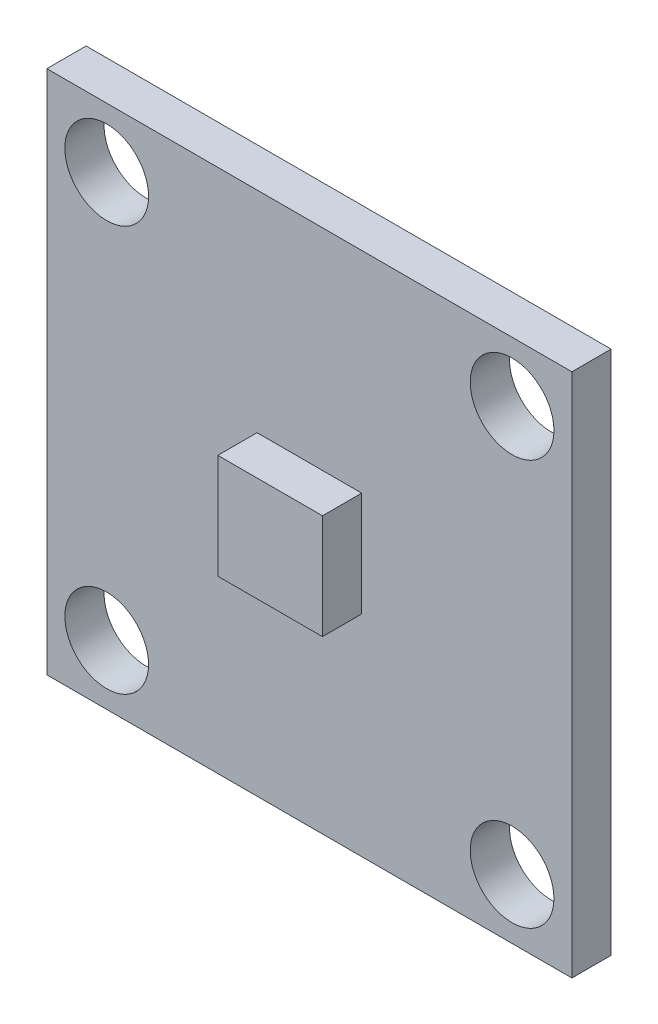
ISO-10303-21;
HEADER;
FILE_DESCRIPTION(('STEP AP214'),'2;1');
FILE_NAME('part.step','',(''),(''),'','','');
FILE_SCHEMA(('AUTOMOTIVE_DESIGN { 1 0 10303 214 1 1 1 1 }'));
ENDSEC;
DATA;
#1=APPLICATION_CONTEXT('core data for automotive mechanical design processes');
#2=APPLICATION_PROTOCOL_DEFINITION('international standard','automotive_design',2000,#1);
#3=PRODUCT_CONTEXT('',#1,'mechanical');
#4=PRODUCT('Part','Part','',(#3));
#5=PRODUCT_RELATED_PRODUCT_CATEGORY('part','',(#4));
#6=PRODUCT_DEFINITION_FORMATION('','',#4);
#7=PRODUCT_DEFINITION_CONTEXT('part definition',#1,'design');
#8=PRODUCT_DEFINITION('design','',#6,#7);
#9=PRODUCT_DEFINITION_SHAPE('','',#8);
#10=(LENGTH_UNIT() NAMED_UNIT(*) SI_UNIT(.MILLI.,.METRE.));
#11=(NAMED_UNIT(*) PLANE_ANGLE_UNIT() SI_UNIT($,.RADIAN.));
#12=(NAMED_UNIT(*) SI_UNIT($,.STERADIAN.) SOLID_ANGLE_UNIT());
#13=UNCERTAINTY_MEASURE_WITH_UNIT(LENGTH_MEASURE(1.E-05),#10,'distance_accuracy_value','');
#14=(GEOMETRIC_REPRESENTATION_CONTEXT(3) GLOBAL_UNCERTAINTY_ASSIGNED_CONTEXT((#13)) GLOBAL_UNIT_ASSIGNED_CONTEXT((#10,
#11,#12)) REPRESENTATION_CONTEXT('',''));
#15=CARTESIAN_POINT('',(0.,0.,0.));
#16=DIRECTION('',(0.,0.,1.));
#17=DIRECTION('',(1.,0.,0.));
#18=AXIS2_PLACEMENT_3D('',#15,#16,#17);
#19=CARTESIAN_POINT('',(0.,0.,1.5));
#20=DIRECTION('',(0.,0.,1.));
#21=DIRECTION('',(1.,0.,0.));
#22=AXIS2_PLACEMENT_3D('',#19,#20,#21);
#23=PLANE('',#22);
#24=CARTESIAN_POINT('',(-7.747,-7.747,1.5));
#25=DIRECTION('',(0.,0.,1.));
#26=DIRECTION('',(1.,0.,0.));
#27=AXIS2_PLACEMENT_3D('',#24,#25,#26);
#28=CIRCLE('',#27,1.6);
#29=CARTESIAN_POINT('',(-6.147,-7.747,1.5));
#30=VERTEX_POINT('',#29);
#31=EDGE_CURVE('E166',#30,#30,#28,.T.);
#32=ORIENTED_EDGE('',*,*,#31,.F.);
#33=EDGE_LOOP('',(#32));
#34=FACE_BOUND('',#33,.T.);
#35=CARTESIAN_POINT('',(-7.747,7.747,1.5));
#36=DIRECTION('',(0.,0.,1.));
#37=DIRECTION('',(1.,0.,0.));
#38=AXIS2_PLACEMENT_3D('',#35,#36,#37);
#39=CIRCLE('',#38,1.6);
#40=CARTESIAN_POINT('',(-6.147,7.747,1.5));
#41=VERTEX_POINT('',#40);
#42=EDGE_CURVE('E182',#41,#41,#39,.T.);
#43=ORIENTED_EDGE('',*,*,#42,.F.);
#44=EDGE_LOOP('',(#43));
#45=FACE_BOUND('',#44,.T.);
#46=DIRECTION('',(0.,-1.,0.));
#47=VECTOR('',#46,1.);
#48=CARTESIAN_POINT('',(-10.033,10.033,1.5));
#49=LINE('',#48,#47);
#50=CARTESIAN_POINT('',(-10.033,10.033,1.5));
#51=VERTEX_POINT('',#50);
#52=CARTESIAN_POINT('',(-10.033,-10.033,1.5));
#53=VERTEX_POINT('',#52);
#54=EDGE_CURVE('E190',#51,#53,#49,.T.);
#55=ORIENTED_EDGE('',*,*,#54,.T.);
#56=DIRECTION('',(1.,0.,0.));
#57=VECTOR('',#56,1.);
#58=CARTESIAN_POINT('',(-10.033,-10.033,1.5));
#59=LINE('',#58,#57);
#60=CARTESIAN_POINT('',(10.033,-10.033,1.5));
#61=VERTEX_POINT('',#60);
#62=EDGE_CURVE('E102',#53,#61,#59,.T.);
#63=ORIENTED_EDGE('',*,*,#62,.T.);
#64=DIRECTION('',(0.,1.,0.));
#65=VECTOR('',#64,1.);
#66=CARTESIAN_POINT('',(10.033,10.033,1.5));
#67=LINE('',#66,#65);
#68=CARTESIAN_POINT('',(10.033,10.033,1.5));
#69=VERTEX_POINT('',#68);
#70=EDGE_CURVE('E195',#61,#69,#67,.T.);
#71=ORIENTED_EDGE('',*,*,#70,.T.);
#72=DIRECTION('',(-1.,0.,0.));
#73=VECTOR('',#72,1.);
#74=CARTESIAN_POINT('',(-10.033,10.033,1.5));
#75=LINE('',#74,#73);
#76=EDGE_CURVE('E74',#69,#51,#75,.T.);
#77=ORIENTED_EDGE('',*,*,#76,.T.);
#78=EDGE_LOOP('',(#55,#63,#71,#77));
#79=FACE_BOUND('',#78,.T.);
#80=CARTESIAN_POINT('',(7.747,7.747,1.5));
#81=DIRECTION('',(0.,0.,1.));
#82=DIRECTION('',(1.,0.,0.));
#83=AXIS2_PLACEMENT_3D('',#80,#81,#82);
#84=CIRCLE('',#83,1.6);
#85=CARTESIAN_POINT('',(9.34700000000001,7.747,1.5));
#86=VERTEX_POINT('',#85);
#87=EDGE_CURVE('E174',#86,#86,#84,.T.);
#88=ORIENTED_EDGE('',*,*,#87,.F.);
#89=EDGE_LOOP('',(#88));
#90=FACE_BOUND('',#89,.T.);
#91=CARTESIAN_POINT('',(7.747,-7.747,1.5));
#92=DIRECTION('',(0.,0.,1.));
#93=DIRECTION('',(1.,0.,0.));
#94=AXIS2_PLACEMENT_3D('',#91,#92,#93);
#95=CIRCLE('',#94,1.6);
#96=CARTESIAN_POINT('',(9.34700000000001,-7.747,1.5));
#97=VERTEX_POINT('',#96);
#98=EDGE_CURVE('E157',#97,#97,#95,.T.);
#99=ORIENTED_EDGE('',*,*,#98,.F.);
#100=EDGE_LOOP('',(#99));
#101=FACE_BOUND('',#100,.T.);
#102=DIRECTION('',(1.,0.,0.));
#103=VECTOR('',#102,1.);
#104=CARTESIAN_POINT('',(-2.,-2.,1.5));
#105=LINE('',#104,#103);
#106=CARTESIAN_POINT('',(-2.,-2.,1.5));
#107=VERTEX_POINT('',#106);
#108=CARTESIAN_POINT('',(2.,-2.,1.5));
#109=VERTEX_POINT('',#108);
#110=EDGE_CURVE('E403',#107,#109,#105,.T.);
#111=ORIENTED_EDGE('',*,*,#110,.F.);
#112=DIRECTION('',(0.,-1.,0.));
#113=VECTOR('',#112,1.);
#114=CARTESIAN_POINT('',(-2.,2.,1.5));
#115=LINE('',#114,#113);
#116=CARTESIAN_POINT('',(-2.,2.,1.5));
#117=VERTEX_POINT('',#116);
#118=EDGE_CURVE('E149',#117,#107,#115,.T.);
#119=ORIENTED_EDGE('',*,*,#118,.F.);
#120=DIRECTION('',(-1.,0.,0.));
#121=VECTOR('',#120,1.);
#122=CARTESIAN_POINT('',(-2.,2.,1.5));
#123=LINE('',#122,#121);
#124=CARTESIAN_POINT('',(2.,2.,1.5));
#125=VERTEX_POINT('',#124);
#126=EDGE_CURVE('E145',#125,#117,#123,.T.);
#127=ORIENTED_EDGE('',*,*,#126,.F.);
#128=DIRECTION('',(0.,1.,0.));
#129=VECTOR('',#128,1.);
#130=CARTESIAN_POINT('',(2.,2.,1.5));
#131=LINE('',#130,#129);
#132=EDGE_CURVE('E399',#109,#125,#131,.T.);
#133=ORIENTED_EDGE('',*,*,#132,.F.);
#134=EDGE_LOOP('',(#111,#119,#127,#133));
#135=FACE_BOUND('',#134,.T.);
#136=ADVANCED_FACE('F49',(#34,#45,#79,#90,#101,#135),#23,.T.);
#137=CARTESIAN_POINT('',(0.,0.,0.));
#138=DIRECTION('',(0.,0.,1.));
#139=DIRECTION('',(1.,0.,0.));
#140=AXIS2_PLACEMENT_3D('',#137,#138,#139);
#141=PLANE('',#140);
#142=DIRECTION('',(0.,-1.,0.));
#143=VECTOR('',#142,1.);
#144=CARTESIAN_POINT('',(-10.033,10.033,0.));
#145=LINE('',#144,#143);
#146=CARTESIAN_POINT('',(-10.033,10.033,0.));
#147=VERTEX_POINT('',#146);
#148=CARTESIAN_POINT('',(-10.033,-10.033,0.));
#149=VERTEX_POINT('',#148);
#150=EDGE_CURVE('E186',#147,#149,#145,.T.);
#151=ORIENTED_EDGE('',*,*,#150,.F.);
#152=DIRECTION('',(-1.,0.,0.));
#153=VECTOR('',#152,1.);
#154=CARTESIAN_POINT('',(-10.033,10.033,0.));
#155=LINE('',#154,#153);
#156=CARTESIAN_POINT('',(10.033,10.033,0.));
#157=VERTEX_POINT('',#156);
#158=EDGE_CURVE('E95',#157,#147,#155,.T.);
#159=ORIENTED_EDGE('',*,*,#158,.F.);
#160=DIRECTION('',(0.,1.,0.));
#161=VECTOR('',#160,1.);
#162=CARTESIAN_POINT('',(10.033,10.033,0.));
#163=LINE('',#162,#161);
#164=CARTESIAN_POINT('',(10.033,-10.033,0.));
#165=VERTEX_POINT('',#164);
#166=EDGE_CURVE('E207',#165,#157,#163,.T.);
#167=ORIENTED_EDGE('',*,*,#166,.F.);
#168=DIRECTION('',(1.,0.,0.));
#169=VECTOR('',#168,1.);
#170=CARTESIAN_POINT('',(-10.033,-10.033,0.));
#171=LINE('',#170,#169);
#172=EDGE_CURVE('E204',#149,#165,#171,.T.);
#173=ORIENTED_EDGE('',*,*,#172,.F.);
#174=EDGE_LOOP('',(#151,#159,#167,#173));
#175=FACE_BOUND('',#174,.T.);
#176=CARTESIAN_POINT('',(-7.747,7.747,0.));
#177=DIRECTION('',(0.,0.,1.));
#178=DIRECTION('',(1.,0.,0.));
#179=AXIS2_PLACEMENT_3D('',#176,#177,#178);
#180=CIRCLE('',#179,1.6);
#181=CARTESIAN_POINT('',(-6.147,7.747,0.));
#182=VERTEX_POINT('',#181);
#183=EDGE_CURVE('E178',#182,#182,#180,.T.);
#184=ORIENTED_EDGE('',*,*,#183,.T.);
#185=EDGE_LOOP('',(#184));
#186=FACE_BOUND('',#185,.T.);
#187=CARTESIAN_POINT('',(7.747,7.747,0.));
#188=DIRECTION('',(0.,0.,1.));
#189=DIRECTION('',(1.,0.,0.));
#190=AXIS2_PLACEMENT_3D('',#187,#188,#189);
#191=CIRCLE('',#190,1.6);
#192=CARTESIAN_POINT('',(9.34700000000001,7.747,0.));
#193=VERTEX_POINT('',#192);
#194=EDGE_CURVE('E170',#193,#193,#191,.T.);
#195=ORIENTED_EDGE('',*,*,#194,.T.);
#196=EDGE_LOOP('',(#195));
#197=FACE_BOUND('',#196,.T.);
#198=CARTESIAN_POINT('',(-7.747,-7.747,0.));
#199=DIRECTION('',(0.,0.,1.));
#200=DIRECTION('',(1.,0.,0.));
#201=AXIS2_PLACEMENT_3D('',#198,#199,#200);
#202=CIRCLE('',#201,1.6);
#203=CARTESIAN_POINT('',(-6.147,-7.747,0.));
#204=VERTEX_POINT('',#203);
#205=EDGE_CURVE('E164',#204,#204,#202,.T.);
#206=ORIENTED_EDGE('',*,*,#205,.T.);
#207=EDGE_LOOP('',(#206));
#208=FACE_BOUND('',#207,.T.);
#209=CARTESIAN_POINT('',(7.747,-7.747,0.));
#210=DIRECTION('',(0.,0.,1.));
#211=DIRECTION('',(1.,0.,0.));
#212=AXIS2_PLACEMENT_3D('',#209,#210,#211);
#213=CIRCLE('',#212,1.6);
#214=CARTESIAN_POINT('',(9.34700000000001,-7.747,0.));
#215=VERTEX_POINT('',#214);
#216=EDGE_CURVE('E152',#215,#215,#213,.T.);
#217=ORIENTED_EDGE('',*,*,#216,.T.);
#218=EDGE_LOOP('',(#217));
#219=FACE_BOUND('',#218,.T.);
#220=ADVANCED_FACE('F225',(#175,#186,#197,#208,#219),#141,.F.);
#221=CARTESIAN_POINT('',(-10.033,10.033,1.5));
#222=DIRECTION('',(1.,0.,0.));
#223=DIRECTION('',(0.,0.,-1.));
#224=AXIS2_PLACEMENT_3D('',#221,#222,#223);
#225=PLANE('',#224);
#226=ORIENTED_EDGE('',*,*,#150,.T.);
#227=DIRECTION('',(0.,0.,-1.));
#228=VECTOR('',#227,1.);
#229=CARTESIAN_POINT('',(-10.033,-10.033,1.5));
#230=LINE('',#229,#228);
#231=EDGE_CURVE('E11',#53,#149,#230,.T.);
#232=ORIENTED_EDGE('',*,*,#231,.F.);
#233=ORIENTED_EDGE('',*,*,#54,.F.);
#234=DIRECTION('',(0.,0.,-1.));
#235=VECTOR('',#234,1.);
#236=CARTESIAN_POINT('',(-10.033,10.033,1.5));
#237=LINE('',#236,#235);
#238=EDGE_CURVE('E200',#51,#147,#237,.T.);
#239=ORIENTED_EDGE('',*,*,#238,.T.);
#240=EDGE_LOOP('',(#226,#232,#233,#239));
#241=FACE_BOUND('',#240,.T.);
#242=ADVANCED_FACE('F51',(#241),#225,.F.);
#243=CARTESIAN_POINT('',(-10.033,-10.033,1.5));
#244=DIRECTION('',(0.,1.,0.));
#245=DIRECTION('',(0.,0.,1.));
#246=AXIS2_PLACEMENT_3D('',#243,#244,#245);
#247=PLANE('',#246);
#248=ORIENTED_EDGE('',*,*,#172,.T.);
#249=DIRECTION('',(0.,0.,-1.));
#250=VECTOR('',#249,1.);
#251=CARTESIAN_POINT('',(10.033,-10.033,1.5));
#252=LINE('',#251,#250);
#253=EDGE_CURVE('E58',#61,#165,#252,.T.);
#254=ORIENTED_EDGE('',*,*,#253,.F.);
#255=ORIENTED_EDGE('',*,*,#62,.F.);
#256=ORIENTED_EDGE('',*,*,#231,.T.);
#257=EDGE_LOOP('',(#248,#254,#255,#256));
#258=FACE_BOUND('',#257,.T.);
#259=ADVANCED_FACE('F241',(#258),#247,.F.);
#260=CARTESIAN_POINT('',(10.033,10.033,1.5));
#261=DIRECTION('',(-1.,0.,0.));
#262=DIRECTION('',(0.,0.,1.));
#263=AXIS2_PLACEMENT_3D('',#260,#261,#262);
#264=PLANE('',#263);
#265=ORIENTED_EDGE('',*,*,#166,.T.);
#266=DIRECTION('',(0.,0.,-1.));
#267=VECTOR('',#266,1.);
#268=CARTESIAN_POINT('',(10.033,10.033,1.5));
#269=LINE('',#268,#267);
#270=EDGE_CURVE('E214',#69,#157,#269,.T.);
#271=ORIENTED_EDGE('',*,*,#270,.F.);
#272=ORIENTED_EDGE('',*,*,#70,.F.);
#273=ORIENTED_EDGE('',*,*,#253,.T.);
#274=EDGE_LOOP('',(#265,#271,#272,#273));
#275=FACE_BOUND('',#274,.T.);
#276=ADVANCED_FACE('F221',(#275),#264,.F.);
#277=CARTESIAN_POINT('',(-10.033,10.033,1.5));
#278=DIRECTION('',(0.,-1.,0.));
#279=DIRECTION('',(0.,0.,-1.));
#280=AXIS2_PLACEMENT_3D('',#277,#278,#279);
#281=PLANE('',#280);
#282=ORIENTED_EDGE('',*,*,#158,.T.);
#283=ORIENTED_EDGE('',*,*,#238,.F.);
#284=ORIENTED_EDGE('',*,*,#76,.F.);
#285=ORIENTED_EDGE('',*,*,#270,.T.);
#286=EDGE_LOOP('',(#282,#283,#284,#285));
#287=FACE_BOUND('',#286,.T.);
#288=ADVANCED_FACE('F230',(#287),#281,.F.);
#289=CARTESIAN_POINT('',(-7.747,7.747,1.5));
#290=DIRECTION('',(0.,0.,-1.));
#291=DIRECTION('',(-1.,0.,0.));
#292=AXIS2_PLACEMENT_3D('',#289,#290,#291);
#293=CYLINDRICAL_SURFACE('',#292,1.6);
#294=ORIENTED_EDGE('',*,*,#42,.T.);
#295=EDGE_LOOP('',(#294));
#296=FACE_BOUND('',#295,.T.);
#297=ORIENTED_EDGE('',*,*,#183,.F.);
#298=EDGE_LOOP('',(#297));
#299=FACE_BOUND('',#298,.T.);
#300=ADVANCED_FACE('F232',(#296,#299),#293,.F.);
#301=CARTESIAN_POINT('',(7.747,7.747,1.5));
#302=DIRECTION('',(0.,0.,-1.));
#303=DIRECTION('',(-1.,0.,0.));
#304=AXIS2_PLACEMENT_3D('',#301,#302,#303);
#305=CYLINDRICAL_SURFACE('',#304,1.6);
#306=ORIENTED_EDGE('',*,*,#87,.T.);
#307=EDGE_LOOP('',(#306));
#308=FACE_BOUND('',#307,.T.);
#309=ORIENTED_EDGE('',*,*,#194,.F.);
#310=EDGE_LOOP('',(#309));
#311=FACE_BOUND('',#310,.T.);
#312=ADVANCED_FACE('F238',(#308,#311),#305,.F.);
#313=CARTESIAN_POINT('',(-7.747,-7.747,1.5));
#314=DIRECTION('',(0.,0.,-1.));
#315=DIRECTION('',(-1.,0.,0.));
#316=AXIS2_PLACEMENT_3D('',#313,#314,#315);
#317=CYLINDRICAL_SURFACE('',#316,1.6);
#318=ORIENTED_EDGE('',*,*,#31,.T.);
#319=EDGE_LOOP('',(#318));
#320=FACE_BOUND('',#319,.T.);
#321=ORIENTED_EDGE('',*,*,#205,.F.);
#322=EDGE_LOOP('',(#321));
#323=FACE_BOUND('',#322,.T.);
#324=ADVANCED_FACE('F255',(#320,#323),#317,.F.);
#325=CARTESIAN_POINT('',(7.747,-7.747,1.5));
#326=DIRECTION('',(0.,0.,-1.));
#327=DIRECTION('',(-1.,0.,0.));
#328=AXIS2_PLACEMENT_3D('',#325,#326,#327);
#329=CYLINDRICAL_SURFACE('',#328,1.6);
#330=ORIENTED_EDGE('',*,*,#98,.T.);
#331=EDGE_LOOP('',(#330));
#332=FACE_BOUND('',#331,.T.);
#333=ORIENTED_EDGE('',*,*,#216,.F.);
#334=EDGE_LOOP('',(#333));
#335=FACE_BOUND('',#334,.T.);
#336=ADVANCED_FACE('F259',(#332,#335),#329,.F.);
#337=CARTESIAN_POINT('',(-2.,2.,3.));
#338=DIRECTION('',(1.,0.,0.));
#339=DIRECTION('',(0.,1.,0.));
#340=AXIS2_PLACEMENT_3D('',#337,#338,#339);
#341=PLANE('',#340);
#342=ORIENTED_EDGE('',*,*,#118,.T.);
#343=DIRECTION('',(0.,0.,-1.));
#344=VECTOR('',#343,1.);
#345=CARTESIAN_POINT('',(-2.,-2.,3.));
#346=LINE('',#345,#344);
#347=CARTESIAN_POINT('',(-2.,-2.,3.));
#348=VERTEX_POINT('',#347);
#349=EDGE_CURVE('E128',#348,#107,#346,.T.);
#350=ORIENTED_EDGE('',*,*,#349,.F.);
#351=DIRECTION('',(0.,-1.,0.));
#352=VECTOR('',#351,1.);
#353=CARTESIAN_POINT('',(-2.,2.,3.));
#354=LINE('',#353,#352);
#355=CARTESIAN_POINT('',(-2.,2.,3.));
#356=VERTEX_POINT('',#355);
#357=EDGE_CURVE('E136',#356,#348,#354,.T.);
#358=ORIENTED_EDGE('',*,*,#357,.F.);
#359=DIRECTION('',(0.,0.,-1.));
#360=VECTOR('',#359,1.);
#361=CARTESIAN_POINT('',(-2.,2.,3.));
#362=LINE('',#361,#360);
#363=EDGE_CURVE('E395',#356,#117,#362,.T.);
#364=ORIENTED_EDGE('',*,*,#363,.T.);
#365=EDGE_LOOP('',(#342,#350,#358,#364));
#366=FACE_BOUND('',#365,.T.);
#367=ADVANCED_FACE('F147',(#366),#341,.F.);
#368=CARTESIAN_POINT('',(-2.,-2.,3.));
#369=DIRECTION('',(0.,1.,0.));
#370=DIRECTION('',(0.,0.,1.));
#371=AXIS2_PLACEMENT_3D('',#368,#369,#370);
#372=PLANE('',#371);
#373=ORIENTED_EDGE('',*,*,#110,.T.);
#374=DIRECTION('',(0.,0.,-1.));
#375=VECTOR('',#374,1.);
#376=CARTESIAN_POINT('',(2.,-2.,3.));
#377=LINE('',#376,#375);
#378=CARTESIAN_POINT('',(2.,-2.,3.));
#379=VERTEX_POINT('',#378);
#380=EDGE_CURVE('E131',#379,#109,#377,.T.);
#381=ORIENTED_EDGE('',*,*,#380,.F.);
#382=DIRECTION('',(1.,0.,0.));
#383=VECTOR('',#382,1.);
#384=CARTESIAN_POINT('',(-2.,-2.,3.));
#385=LINE('',#384,#383);
#386=EDGE_CURVE('E124',#348,#379,#385,.T.);
#387=ORIENTED_EDGE('',*,*,#386,.F.);
#388=ORIENTED_EDGE('',*,*,#349,.T.);
#389=EDGE_LOOP('',(#373,#381,#387,#388));
#390=FACE_BOUND('',#389,.T.);
#391=ADVANCED_FACE('F126',(#390),#372,.F.);
#392=CARTESIAN_POINT('',(2.,2.,3.));
#393=DIRECTION('',(-1.,0.,0.));
#394=DIRECTION('',(0.,-1.,0.));
#395=AXIS2_PLACEMENT_3D('',#392,#393,#394);
#396=PLANE('',#395);
#397=ORIENTED_EDGE('',*,*,#132,.T.);
#398=DIRECTION('',(0.,0.,-1.));
#399=VECTOR('',#398,1.);
#400=CARTESIAN_POINT('',(2.,2.,3.));
#401=LINE('',#400,#399);
#402=CARTESIAN_POINT('',(2.,2.,3.));
#403=VERTEX_POINT('',#402);
#404=EDGE_CURVE('E65',#403,#125,#401,.T.);
#405=ORIENTED_EDGE('',*,*,#404,.F.);
#406=DIRECTION('',(0.,1.,0.));
#407=VECTOR('',#406,1.);
#408=CARTESIAN_POINT('',(2.,2.,3.));
#409=LINE('',#408,#407);
#410=EDGE_CURVE('E135',#379,#403,#409,.T.);
#411=ORIENTED_EDGE('',*,*,#410,.F.);
#412=ORIENTED_EDGE('',*,*,#380,.T.);
#413=EDGE_LOOP('',(#397,#405,#411,#412));
#414=FACE_BOUND('',#413,.T.);
#415=ADVANCED_FACE('F268',(#414),#396,.F.);
#416=CARTESIAN_POINT('',(-2.,2.,3.));
#417=DIRECTION('',(0.,-1.,0.));
#418=DIRECTION('',(0.,0.,-1.));
#419=AXIS2_PLACEMENT_3D('',#416,#417,#418);
#420=PLANE('',#419);
#421=ORIENTED_EDGE('',*,*,#126,.T.);
#422=ORIENTED_EDGE('',*,*,#363,.F.);
#423=DIRECTION('',(-1.,0.,0.));
#424=VECTOR('',#423,1.);
#425=CARTESIAN_POINT('',(-2.,2.,3.));
#426=LINE('',#425,#424);
#427=EDGE_CURVE('E140',#403,#356,#426,.T.);
#428=ORIENTED_EDGE('',*,*,#427,.F.);
#429=ORIENTED_EDGE('',*,*,#404,.T.);
#430=EDGE_LOOP('',(#421,#422,#428,#429));
#431=FACE_BOUND('',#430,.T.);
#432=ADVANCED_FACE('F271',(#431),#420,.F.);
#433=CARTESIAN_POINT('',(0.,0.,3.));
#434=DIRECTION('',(0.,0.,1.));
#435=DIRECTION('',(1.,0.,0.));
#436=AXIS2_PLACEMENT_3D('',#433,#434,#435);
#437=PLANE('',#436);
#438=ORIENTED_EDGE('',*,*,#357,.T.);
#439=ORIENTED_EDGE('',*,*,#386,.T.);
#440=ORIENTED_EDGE('',*,*,#410,.T.);
#441=ORIENTED_EDGE('',*,*,#427,.T.);
#442=EDGE_LOOP('',(#438,#439,#440,#441));
#443=FACE_BOUND('',#442,.T.);
#444=ADVANCED_FACE('F139',(#443),#437,.T.);
#445=CLOSED_SHELL('',(#136,#220,#242,#259,#276,#288,#300,#312,#324,#336,#367,#391,#415,#432,#444));
#446=MANIFOLD_SOLID_BREP('B2',#445);
#447=ADVANCED_BREP_SHAPE_REPRESENTATION('',(#18,#446),#14);
#448=SHAPE_DEFINITION_REPRESENTATION(#9,#447);
ENDSEC;
END-ISO-10303-21;
